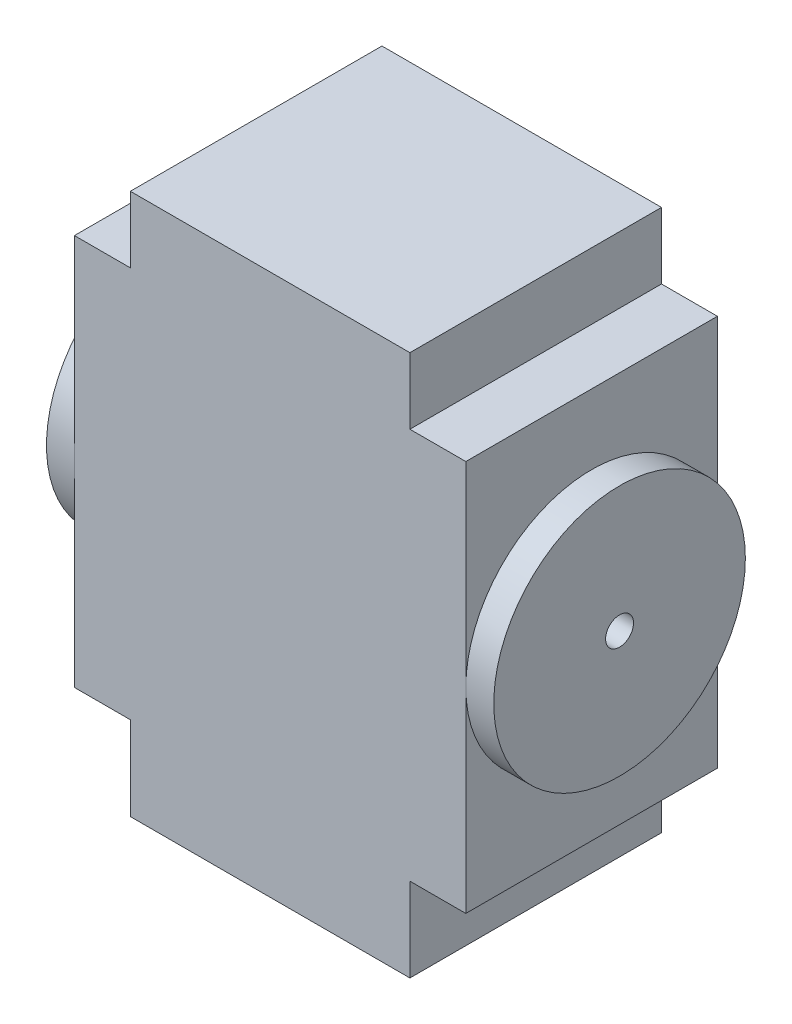
ISO-10303-21;
HEADER;
FILE_DESCRIPTION(('STEP AP214'),'2;1');
FILE_NAME('part.step','',(''),(''),'','','');
FILE_SCHEMA(('AUTOMOTIVE_DESIGN { 1 0 10303 214 1 1 1 1 }'));
ENDSEC;
DATA;
#1=APPLICATION_CONTEXT('core data for automotive mechanical design processes');
#2=APPLICATION_PROTOCOL_DEFINITION('international standard','automotive_design',2000,#1);
#3=PRODUCT_CONTEXT('',#1,'mechanical');
#4=PRODUCT('Part','Part','',(#3));
#5=PRODUCT_RELATED_PRODUCT_CATEGORY('part','',(#4));
#6=PRODUCT_DEFINITION_FORMATION('','',#4);
#7=PRODUCT_DEFINITION_CONTEXT('part definition',#1,'design');
#8=PRODUCT_DEFINITION('design','',#6,#7);
#9=PRODUCT_DEFINITION_SHAPE('','',#8);
#10=(LENGTH_UNIT() NAMED_UNIT(*) SI_UNIT(.MILLI.,.METRE.));
#11=(NAMED_UNIT(*) PLANE_ANGLE_UNIT() SI_UNIT($,.RADIAN.));
#12=(NAMED_UNIT(*) SI_UNIT($,.STERADIAN.) SOLID_ANGLE_UNIT());
#13=UNCERTAINTY_MEASURE_WITH_UNIT(LENGTH_MEASURE(1.E-05),#10,'distance_accuracy_value','');
#14=(GEOMETRIC_REPRESENTATION_CONTEXT(3) GLOBAL_UNCERTAINTY_ASSIGNED_CONTEXT((#13)) GLOBAL_UNIT_ASSIGNED_CONTEXT((#10,
#11,#12)) REPRESENTATION_CONTEXT('',''));
#15=CARTESIAN_POINT('',(0.,0.,0.));
#16=DIRECTION('',(0.,0.,1.));
#17=DIRECTION('',(1.,0.,0.));
#18=AXIS2_PLACEMENT_3D('',#15,#16,#17);
#19=CARTESIAN_POINT('',(-8.5906144898083,0.,-3.27253788630534));
#20=DIRECTION('',(-1.,0.,0.));
#21=DIRECTION('',(0.,0.,1.));
#22=AXIS2_PLACEMENT_3D('',#19,#20,#21);
#23=PLANE('',#22);
#24=DIRECTION('',(0.,-1.,0.));
#25=VECTOR('',#24,1.);
#26=CARTESIAN_POINT('',(-8.5906144898083,-8.59061448980831,-3.27253788630534));
#27=LINE('',#26,#25);
#28=CARTESIAN_POINT('',(-8.5906144898083,8.5906144898083,-3.27253788630534));
#29=VERTEX_POINT('',#28);
#30=CARTESIAN_POINT('',(-8.59061448980831,0.,-3.27253788630534));
#31=VERTEX_POINT('',#30);
#32=EDGE_CURVE('E259',#29,#31,#27,.T.);
#33=ORIENTED_EDGE('',*,*,#32,.T.);
#34=CARTESIAN_POINT('',(-8.59061448980831,0.,2.25));
#35=DIRECTION('',(1.,0.,0.));
#36=DIRECTION('',(0.,0.,-1.));
#37=AXIS2_PLACEMENT_3D('',#34,#35,#36);
#38=CIRCLE('',#37,5.52253788630534);
#39=CARTESIAN_POINT('',(-8.59061448980831,0.,7.77253788630534));
#40=VERTEX_POINT('',#39);
#41=EDGE_CURVE('E54',#31,#40,#38,.T.);
#42=ORIENTED_EDGE('',*,*,#41,.T.);
#43=DIRECTION('',(0.,1.,0.));
#44=VECTOR('',#43,1.);
#45=CARTESIAN_POINT('',(-8.5906144898083,-8.59061448980831,7.77253788630534));
#46=LINE('',#45,#44);
#47=CARTESIAN_POINT('',(-8.5906144898083,8.5906144898083,7.77253788630534));
#48=VERTEX_POINT('',#47);
#49=EDGE_CURVE('E335',#40,#48,#46,.T.);
#50=ORIENTED_EDGE('',*,*,#49,.T.);
#51=DIRECTION('',(0.,0.,-1.));
#52=VECTOR('',#51,1.);
#53=CARTESIAN_POINT('',(-8.5906144898083,8.5906144898083,7.77253788630534));
#54=LINE('',#53,#52);
#55=EDGE_CURVE('E264',#48,#29,#54,.T.);
#56=ORIENTED_EDGE('',*,*,#55,.T.);
#57=EDGE_LOOP('',(#33,#42,#50,#56));
#58=FACE_BOUND('',#57,.T.);
#59=ADVANCED_FACE('F42',(#58),#23,.T.);
#60=CARTESIAN_POINT('',(8.59061448980831,0.,-3.27253788630534));
#61=DIRECTION('',(-1.,0.,0.));
#62=DIRECTION('',(0.,0.,1.));
#63=AXIS2_PLACEMENT_3D('',#60,#61,#62);
#64=PLANE('',#63);
#65=CARTESIAN_POINT('',(8.59061448980831,0.,2.25));
#66=DIRECTION('',(1.,0.,0.));
#67=DIRECTION('',(0.,0.,-1.));
#68=AXIS2_PLACEMENT_3D('',#65,#66,#67);
#69=CIRCLE('',#68,5.52253788630534);
#70=CARTESIAN_POINT('',(8.59061448980831,0.,-3.27253788630534));
#71=VERTEX_POINT('',#70);
#72=CARTESIAN_POINT('',(8.59061448980831,0.,7.77253788630534));
#73=VERTEX_POINT('',#72);
#74=EDGE_CURVE('E208',#71,#73,#69,.T.);
#75=ORIENTED_EDGE('',*,*,#74,.F.);
#76=DIRECTION('',(0.,1.,0.));
#77=VECTOR('',#76,1.);
#78=CARTESIAN_POINT('',(8.59061448980831,-8.59061448980831,-3.27253788630534));
#79=LINE('',#78,#77);
#80=CARTESIAN_POINT('',(8.59061448980831,8.5906144898083,-3.27253788630534));
#81=VERTEX_POINT('',#80);
#82=EDGE_CURVE('E289',#71,#81,#79,.T.);
#83=ORIENTED_EDGE('',*,*,#82,.T.);
#84=DIRECTION('',(0.,0.,1.));
#85=VECTOR('',#84,1.);
#86=CARTESIAN_POINT('',(8.59061448980831,8.5906144898083,7.77253788630534));
#87=LINE('',#86,#85);
#88=CARTESIAN_POINT('',(8.59061448980831,8.5906144898083,7.77253788630534));
#89=VERTEX_POINT('',#88);
#90=EDGE_CURVE('E288',#81,#89,#87,.T.);
#91=ORIENTED_EDGE('',*,*,#90,.T.);
#92=DIRECTION('',(0.,-1.,0.));
#93=VECTOR('',#92,1.);
#94=CARTESIAN_POINT('',(8.59061448980831,-8.59061448980831,7.77253788630534));
#95=LINE('',#94,#93);
#96=EDGE_CURVE('E293',#89,#73,#95,.T.);
#97=ORIENTED_EDGE('',*,*,#96,.T.);
#98=EDGE_LOOP('',(#75,#83,#91,#97));
#99=FACE_BOUND('',#98,.T.);
#100=ADVANCED_FACE('F365',(#99),#64,.F.);
#101=CARTESIAN_POINT('',(-6.13615320700593,-12.2723064140119,7.77253788630534));
#102=DIRECTION('',(1.,0.,0.));
#103=DIRECTION('',(0.,0.,-1.));
#104=AXIS2_PLACEMENT_3D('',#101,#102,#103);
#105=PLANE('',#104);
#106=DIRECTION('',(0.,-1.,0.));
#107=VECTOR('',#106,1.);
#108=CARTESIAN_POINT('',(-6.13615320700593,-12.2723064140119,7.77253788630534));
#109=LINE('',#108,#107);
#110=CARTESIAN_POINT('',(-6.13615320700593,11.5023064140119,7.77253788630534));
#111=VERTEX_POINT('',#110);
#112=CARTESIAN_POINT('',(-6.13615320700593,8.5906144898083,7.77253788630534));
#113=VERTEX_POINT('',#112);
#114=EDGE_CURVE('E181',#111,#113,#109,.T.);
#115=ORIENTED_EDGE('',*,*,#114,.F.);
#116=DIRECTION('',(0.,0.,-1.));
#117=VECTOR('',#116,1.);
#118=CARTESIAN_POINT('',(-6.13615320700593,11.5023064140119,7.77253788630534));
#119=LINE('',#118,#117);
#120=CARTESIAN_POINT('',(-6.13615320700593,11.5023064140119,-3.27253788630534));
#121=VERTEX_POINT('',#120);
#122=EDGE_CURVE('E146',#111,#121,#119,.T.);
#123=ORIENTED_EDGE('',*,*,#122,.T.);
#124=DIRECTION('',(0.,-1.,0.));
#125=VECTOR('',#124,1.);
#126=CARTESIAN_POINT('',(-6.13615320700593,-12.2723064140119,-3.27253788630534));
#127=LINE('',#126,#125);
#128=CARTESIAN_POINT('',(-6.13615320700593,8.5906144898083,-3.27253788630534));
#129=VERTEX_POINT('',#128);
#130=EDGE_CURVE('E175',#121,#129,#127,.T.);
#131=ORIENTED_EDGE('',*,*,#130,.T.);
#132=DIRECTION('',(0.,0.,-1.));
#133=VECTOR('',#132,1.);
#134=CARTESIAN_POINT('',(-6.13615320700593,8.5906144898083,7.77253788630534));
#135=LINE('',#134,#133);
#136=EDGE_CURVE('E274',#113,#129,#135,.T.);
#137=ORIENTED_EDGE('',*,*,#136,.F.);
#138=EDGE_LOOP('',(#115,#123,#131,#137));
#139=FACE_BOUND('',#138,.T.);
#140=ADVANCED_FACE('F249',(#139),#105,.F.);
#141=DIRECTION('',(0.,0.,1.));
#142=VECTOR('',#141,1.);
#143=CARTESIAN_POINT('',(-6.13615320700593,-8.59061448980831,7.77253788630534));
#144=LINE('',#143,#142);
#145=CARTESIAN_POINT('',(-6.13615320700593,-8.59061448980831,-3.27253788630534));
#146=VERTEX_POINT('',#145);
#147=CARTESIAN_POINT('',(-6.13615320700593,-8.59061448980831,7.77253788630534));
#148=VERTEX_POINT('',#147);
#149=EDGE_CURVE('E220',#146,#148,#144,.T.);
#150=ORIENTED_EDGE('',*,*,#149,.F.);
#151=CARTESIAN_POINT('',(-6.13615320700593,-12.2723064140119,-3.27253788630534));
#152=VERTEX_POINT('',#151);
#153=EDGE_CURVE('E191',#146,#152,#127,.T.);
#154=ORIENTED_EDGE('',*,*,#153,.T.);
#155=DIRECTION('',(0.,0.,-1.));
#156=VECTOR('',#155,1.);
#157=CARTESIAN_POINT('',(-6.13615320700593,-12.2723064140119,7.77253788630534));
#158=LINE('',#157,#156);
#159=CARTESIAN_POINT('',(-6.13615320700593,-12.2723064140119,7.77253788630534));
#160=VERTEX_POINT('',#159);
#161=EDGE_CURVE('E46',#160,#152,#158,.T.);
#162=ORIENTED_EDGE('',*,*,#161,.F.);
#163=EDGE_CURVE('E174',#148,#160,#109,.T.);
#164=ORIENTED_EDGE('',*,*,#163,.F.);
#165=EDGE_LOOP('',(#150,#154,#162,#164));
#166=FACE_BOUND('',#165,.T.);
#167=ADVANCED_FACE('F323',(#166),#105,.F.);
#168=CARTESIAN_POINT('',(6.13615320700593,-12.2723064140119,7.77253788630534));
#169=DIRECTION('',(-1.,0.,0.));
#170=DIRECTION('',(0.,0.,1.));
#171=AXIS2_PLACEMENT_3D('',#168,#169,#170);
#172=PLANE('',#171);
#173=DIRECTION('',(0.,0.,-1.));
#174=VECTOR('',#173,1.);
#175=CARTESIAN_POINT('',(6.13615320700593,-8.59061448980831,7.77253788630534));
#176=LINE('',#175,#174);
#177=CARTESIAN_POINT('',(6.13615320700593,-8.59061448980831,7.77253788630534));
#178=VERTEX_POINT('',#177);
#179=CARTESIAN_POINT('',(6.13615320700593,-8.59061448980831,-3.27253788630534));
#180=VERTEX_POINT('',#179);
#181=EDGE_CURVE('E303',#178,#180,#176,.T.);
#182=ORIENTED_EDGE('',*,*,#181,.F.);
#183=DIRECTION('',(0.,1.,0.));
#184=VECTOR('',#183,1.);
#185=CARTESIAN_POINT('',(6.13615320700593,-12.2723064140119,7.77253788630534));
#186=LINE('',#185,#184);
#187=CARTESIAN_POINT('',(6.13615320700593,-12.2723064140119,7.77253788630534));
#188=VERTEX_POINT('',#187);
#189=EDGE_CURVE('E168',#188,#178,#186,.T.);
#190=ORIENTED_EDGE('',*,*,#189,.F.);
#191=DIRECTION('',(0.,0.,-1.));
#192=VECTOR('',#191,1.);
#193=CARTESIAN_POINT('',(6.13615320700593,-12.2723064140119,7.77253788630534));
#194=LINE('',#193,#192);
#195=CARTESIAN_POINT('',(6.13615320700593,-12.2723064140119,-3.27253788630534));
#196=VERTEX_POINT('',#195);
#197=EDGE_CURVE('E187',#188,#196,#194,.T.);
#198=ORIENTED_EDGE('',*,*,#197,.T.);
#199=DIRECTION('',(0.,1.,0.));
#200=VECTOR('',#199,1.);
#201=CARTESIAN_POINT('',(6.13615320700593,-12.2723064140119,-3.27253788630534));
#202=LINE('',#201,#200);
#203=EDGE_CURVE('E188',#196,#180,#202,.T.);
#204=ORIENTED_EDGE('',*,*,#203,.T.);
#205=EDGE_LOOP('',(#182,#190,#198,#204));
#206=FACE_BOUND('',#205,.T.);
#207=ADVANCED_FACE('F44',(#206),#172,.F.);
#208=CARTESIAN_POINT('',(6.13615320700593,8.5906144898083,-3.27253788630534));
#209=VERTEX_POINT('',#208);
#210=CARTESIAN_POINT('',(6.13615320700593,11.5023064140119,-3.27253788630534));
#211=VERTEX_POINT('',#210);
#212=EDGE_CURVE('E159',#209,#211,#202,.T.);
#213=ORIENTED_EDGE('',*,*,#212,.T.);
#214=DIRECTION('',(0.,0.,-1.));
#215=VECTOR('',#214,1.);
#216=CARTESIAN_POINT('',(6.13615320700593,11.5023064140119,7.77253788630534));
#217=LINE('',#216,#215);
#218=CARTESIAN_POINT('',(6.13615320700593,11.5023064140119,7.77253788630534));
#219=VERTEX_POINT('',#218);
#220=EDGE_CURVE('E61',#219,#211,#217,.T.);
#221=ORIENTED_EDGE('',*,*,#220,.F.);
#222=CARTESIAN_POINT('',(6.13615320700593,8.5906144898083,7.77253788630534));
#223=VERTEX_POINT('',#222);
#224=EDGE_CURVE('E156',#223,#219,#186,.T.);
#225=ORIENTED_EDGE('',*,*,#224,.F.);
#226=DIRECTION('',(0.,0.,1.));
#227=VECTOR('',#226,1.);
#228=CARTESIAN_POINT('',(6.13615320700593,8.5906144898083,7.77253788630534));
#229=LINE('',#228,#227);
#230=EDGE_CURVE('E284',#209,#223,#229,.T.);
#231=ORIENTED_EDGE('',*,*,#230,.F.);
#232=EDGE_LOOP('',(#213,#221,#225,#231));
#233=FACE_BOUND('',#232,.T.);
#234=ADVANCED_FACE('F155',(#233),#172,.F.);
#235=CARTESIAN_POINT('',(-6.13615320700593,-12.2723064140119,7.77253788630534));
#236=DIRECTION('',(0.,1.,0.));
#237=DIRECTION('',(0.,0.,1.));
#238=AXIS2_PLACEMENT_3D('',#235,#236,#237);
#239=PLANE('',#238);
#240=DIRECTION('',(1.,0.,0.));
#241=VECTOR('',#240,1.);
#242=CARTESIAN_POINT('',(-6.13615320700593,-12.2723064140119,-3.27253788630534));
#243=LINE('',#242,#241);
#244=EDGE_CURVE('E169',#152,#196,#243,.T.);
#245=ORIENTED_EDGE('',*,*,#244,.T.);
#246=ORIENTED_EDGE('',*,*,#197,.F.);
#247=DIRECTION('',(1.,0.,0.));
#248=VECTOR('',#247,1.);
#249=CARTESIAN_POINT('',(-6.13615320700593,-12.2723064140119,7.77253788630534));
#250=LINE('',#249,#248);
#251=EDGE_CURVE('E184',#160,#188,#250,.T.);
#252=ORIENTED_EDGE('',*,*,#251,.F.);
#253=ORIENTED_EDGE('',*,*,#161,.T.);
#254=EDGE_LOOP('',(#245,#246,#252,#253));
#255=FACE_BOUND('',#254,.T.);
#256=ADVANCED_FACE('F352',(#255),#239,.F.);
#257=CARTESIAN_POINT('',(0.,0.,7.77253788630534));
#258=DIRECTION('',(0.,0.,-1.));
#259=DIRECTION('',(-1.,0.,0.));
#260=AXIS2_PLACEMENT_3D('',#257,#258,#259);
#261=PLANE('',#260);
#262=ORIENTED_EDGE('',*,*,#224,.T.);
#263=DIRECTION('',(-1.,0.,0.));
#264=VECTOR('',#263,1.);
#265=CARTESIAN_POINT('',(6.13615320700593,11.5023064140119,7.77253788630534));
#266=LINE('',#265,#264);
#267=EDGE_CURVE('E143',#219,#111,#266,.T.);
#268=ORIENTED_EDGE('',*,*,#267,.T.);
#269=ORIENTED_EDGE('',*,*,#114,.T.);
#270=DIRECTION('',(1.,0.,0.));
#271=VECTOR('',#270,1.);
#272=CARTESIAN_POINT('',(-8.5906144898083,8.5906144898083,7.77253788630534));
#273=LINE('',#272,#271);
#274=EDGE_CURVE('E263',#48,#113,#273,.T.);
#275=ORIENTED_EDGE('',*,*,#274,.F.);
#276=ORIENTED_EDGE('',*,*,#49,.F.);
#277=CARTESIAN_POINT('',(-8.5906144898083,-8.59061448980831,7.77253788630534));
#278=VERTEX_POINT('',#277);
#279=EDGE_CURVE('E271',#278,#40,#46,.T.);
#280=ORIENTED_EDGE('',*,*,#279,.F.);
#281=DIRECTION('',(1.,0.,0.));
#282=VECTOR('',#281,1.);
#283=CARTESIAN_POINT('',(-8.5906144898083,-8.59061448980831,7.77253788630534));
#284=LINE('',#283,#282);
#285=EDGE_CURVE('E269',#278,#148,#284,.T.);
#286=ORIENTED_EDGE('',*,*,#285,.T.);
#287=ORIENTED_EDGE('',*,*,#163,.T.);
#288=ORIENTED_EDGE('',*,*,#251,.T.);
#289=ORIENTED_EDGE('',*,*,#189,.T.);
#290=DIRECTION('',(-1.,0.,0.));
#291=VECTOR('',#290,1.);
#292=CARTESIAN_POINT('',(8.59061448980831,-8.59061448980831,7.77253788630534));
#293=LINE('',#292,#291);
#294=CARTESIAN_POINT('',(8.59061448980831,-8.59061448980831,7.77253788630534));
#295=VERTEX_POINT('',#294);
#296=EDGE_CURVE('E310',#295,#178,#293,.T.);
#297=ORIENTED_EDGE('',*,*,#296,.F.);
#298=EDGE_CURVE('E292',#73,#295,#95,.T.);
#299=ORIENTED_EDGE('',*,*,#298,.F.);
#300=ORIENTED_EDGE('',*,*,#96,.F.);
#301=DIRECTION('',(-1.,0.,0.));
#302=VECTOR('',#301,1.);
#303=CARTESIAN_POINT('',(8.59061448980831,8.5906144898083,7.77253788630534));
#304=LINE('',#303,#302);
#305=EDGE_CURVE('E166',#89,#223,#304,.T.);
#306=ORIENTED_EDGE('',*,*,#305,.T.);
#307=EDGE_LOOP('',(#262,#268,#269,#275,#276,#280,#286,#287,#288,#289,#297,#299,#300,#306));
#308=FACE_BOUND('',#307,.T.);
#309=ADVANCED_FACE('F163',(#308),#261,.F.);
#310=CARTESIAN_POINT('',(0.,0.,-3.27253788630534));
#311=DIRECTION('',(0.,0.,-1.));
#312=DIRECTION('',(-1.,0.,0.));
#313=AXIS2_PLACEMENT_3D('',#310,#311,#312);
#314=PLANE('',#313);
#315=DIRECTION('',(-1.,0.,0.));
#316=VECTOR('',#315,1.);
#317=CARTESIAN_POINT('',(6.13615320700593,11.5023064140119,-3.27253788630534));
#318=LINE('',#317,#316);
#319=EDGE_CURVE('E151',#211,#121,#318,.T.);
#320=ORIENTED_EDGE('',*,*,#319,.F.);
#321=ORIENTED_EDGE('',*,*,#212,.F.);
#322=DIRECTION('',(-1.,0.,0.));
#323=VECTOR('',#322,1.);
#324=CARTESIAN_POINT('',(8.59061448980831,8.5906144898083,-3.27253788630534));
#325=LINE('',#324,#323);
#326=EDGE_CURVE('E179',#81,#209,#325,.T.);
#327=ORIENTED_EDGE('',*,*,#326,.F.);
#328=ORIENTED_EDGE('',*,*,#82,.F.);
#329=CARTESIAN_POINT('',(8.59061448980831,-8.59061448980831,-3.27253788630534));
#330=VERTEX_POINT('',#329);
#331=EDGE_CURVE('E285',#330,#71,#79,.T.);
#332=ORIENTED_EDGE('',*,*,#331,.F.);
#333=DIRECTION('',(-1.,0.,0.));
#334=VECTOR('',#333,1.);
#335=CARTESIAN_POINT('',(8.59061448980831,-8.59061448980831,-3.27253788630534));
#336=LINE('',#335,#334);
#337=EDGE_CURVE('E300',#330,#180,#336,.T.);
#338=ORIENTED_EDGE('',*,*,#337,.T.);
#339=ORIENTED_EDGE('',*,*,#203,.F.);
#340=ORIENTED_EDGE('',*,*,#244,.F.);
#341=ORIENTED_EDGE('',*,*,#153,.F.);
#342=DIRECTION('',(1.,0.,0.));
#343=VECTOR('',#342,1.);
#344=CARTESIAN_POINT('',(-8.5906144898083,-8.59061448980831,-3.27253788630534));
#345=LINE('',#344,#343);
#346=CARTESIAN_POINT('',(-8.5906144898083,-8.59061448980831,-3.27253788630534));
#347=VERTEX_POINT('',#346);
#348=EDGE_CURVE('E280',#347,#146,#345,.T.);
#349=ORIENTED_EDGE('',*,*,#348,.F.);
#350=EDGE_CURVE('E340',#31,#347,#27,.T.);
#351=ORIENTED_EDGE('',*,*,#350,.F.);
#352=ORIENTED_EDGE('',*,*,#32,.F.);
#353=DIRECTION('',(1.,0.,0.));
#354=VECTOR('',#353,1.);
#355=CARTESIAN_POINT('',(-8.5906144898083,8.5906144898083,-3.27253788630534));
#356=LINE('',#355,#354);
#357=EDGE_CURVE('E256',#29,#129,#356,.T.);
#358=ORIENTED_EDGE('',*,*,#357,.T.);
#359=ORIENTED_EDGE('',*,*,#130,.F.);
#360=EDGE_LOOP('',(#320,#321,#327,#328,#332,#338,#339,#340,#341,#349,#351,#352,#358,#359));
#361=FACE_BOUND('',#360,.T.);
#362=ADVANCED_FACE('F253',(#361),#314,.T.);
#363=CARTESIAN_POINT('',(8.59061448980831,8.5906144898083,7.77253788630534));
#364=DIRECTION('',(0.,-1.,0.));
#365=DIRECTION('',(0.,0.,-1.));
#366=AXIS2_PLACEMENT_3D('',#363,#364,#365);
#367=PLANE('',#366);
#368=ORIENTED_EDGE('',*,*,#230,.T.);
#369=ORIENTED_EDGE('',*,*,#305,.F.);
#370=ORIENTED_EDGE('',*,*,#90,.F.);
#371=ORIENTED_EDGE('',*,*,#326,.T.);
#372=EDGE_LOOP('',(#368,#369,#370,#371));
#373=FACE_BOUND('',#372,.T.);
#374=ADVANCED_FACE('F366',(#373),#367,.F.);
#375=CARTESIAN_POINT('',(8.59061448980831,-8.59061448980831,7.77253788630534));
#376=DIRECTION('',(0.,1.,0.));
#377=DIRECTION('',(0.,0.,1.));
#378=AXIS2_PLACEMENT_3D('',#375,#376,#377);
#379=PLANE('',#378);
#380=ORIENTED_EDGE('',*,*,#181,.T.);
#381=ORIENTED_EDGE('',*,*,#337,.F.);
#382=DIRECTION('',(0.,0.,-1.));
#383=VECTOR('',#382,1.);
#384=CARTESIAN_POINT('',(8.59061448980831,-8.59061448980831,7.77253788630534));
#385=LINE('',#384,#383);
#386=EDGE_CURVE('E297',#295,#330,#385,.T.);
#387=ORIENTED_EDGE('',*,*,#386,.F.);
#388=ORIENTED_EDGE('',*,*,#296,.T.);
#389=EDGE_LOOP('',(#380,#381,#387,#388));
#390=FACE_BOUND('',#389,.T.);
#391=ADVANCED_FACE('F355',(#390),#379,.F.);
#392=EDGE_CURVE('E52',#73,#71,#69,.T.);
#393=ORIENTED_EDGE('',*,*,#392,.F.);
#394=ORIENTED_EDGE('',*,*,#298,.T.);
#395=ORIENTED_EDGE('',*,*,#386,.T.);
#396=ORIENTED_EDGE('',*,*,#331,.T.);
#397=EDGE_LOOP('',(#393,#394,#395,#396));
#398=FACE_BOUND('',#397,.T.);
#399=ADVANCED_FACE('F360',(#398),#64,.F.);
#400=CARTESIAN_POINT('',(-8.5906144898083,-8.59061448980831,7.77253788630534));
#401=DIRECTION('',(0.,1.,0.));
#402=DIRECTION('',(0.,0.,1.));
#403=AXIS2_PLACEMENT_3D('',#400,#401,#402);
#404=PLANE('',#403);
#405=ORIENTED_EDGE('',*,*,#149,.T.);
#406=ORIENTED_EDGE('',*,*,#285,.F.);
#407=DIRECTION('',(0.,0.,1.));
#408=VECTOR('',#407,1.);
#409=CARTESIAN_POINT('',(-8.5906144898083,-8.59061448980831,7.77253788630534));
#410=LINE('',#409,#408);
#411=EDGE_CURVE('E330',#347,#278,#410,.T.);
#412=ORIENTED_EDGE('',*,*,#411,.F.);
#413=ORIENTED_EDGE('',*,*,#348,.T.);
#414=EDGE_LOOP('',(#405,#406,#412,#413));
#415=FACE_BOUND('',#414,.T.);
#416=ADVANCED_FACE('F328',(#415),#404,.F.);
#417=CARTESIAN_POINT('',(-8.5906144898083,8.5906144898083,7.77253788630534));
#418=DIRECTION('',(0.,-1.,0.));
#419=DIRECTION('',(0.,0.,-1.));
#420=AXIS2_PLACEMENT_3D('',#417,#418,#419);
#421=PLANE('',#420);
#422=ORIENTED_EDGE('',*,*,#136,.T.);
#423=ORIENTED_EDGE('',*,*,#357,.F.);
#424=ORIENTED_EDGE('',*,*,#55,.F.);
#425=ORIENTED_EDGE('',*,*,#274,.T.);
#426=EDGE_LOOP('',(#422,#423,#424,#425));
#427=FACE_BOUND('',#426,.T.);
#428=ADVANCED_FACE('F349',(#427),#421,.F.);
#429=ORIENTED_EDGE('',*,*,#279,.T.);
#430=EDGE_CURVE('E11',#40,#31,#38,.T.);
#431=ORIENTED_EDGE('',*,*,#430,.T.);
#432=ORIENTED_EDGE('',*,*,#350,.T.);
#433=ORIENTED_EDGE('',*,*,#411,.T.);
#434=EDGE_LOOP('',(#429,#431,#432,#433));
#435=FACE_BOUND('',#434,.T.);
#436=ADVANCED_FACE('F345',(#435),#23,.T.);
#437=CARTESIAN_POINT('',(9.81784513120949,0.,2.25));
#438=DIRECTION('',(-1.,0.,0.));
#439=DIRECTION('',(0.,0.,1.));
#440=AXIS2_PLACEMENT_3D('',#437,#438,#439);
#441=CYLINDRICAL_SURFACE('',#440,5.52253788630534);
#442=CARTESIAN_POINT('',(9.81784513120949,0.,2.25));
#443=DIRECTION('',(1.,0.,0.));
#444=DIRECTION('',(0.,0.,-1.));
#445=AXIS2_PLACEMENT_3D('',#442,#443,#444);
#446=CIRCLE('',#445,5.52253788630534);
#447=CARTESIAN_POINT('',(9.81784513120949,0.,-3.27253788630534));
#448=VERTEX_POINT('',#447);
#449=EDGE_CURVE('E214',#448,#448,#446,.T.);
#450=ORIENTED_EDGE('',*,*,#449,.F.);
#451=EDGE_LOOP('',(#450));
#452=FACE_BOUND('',#451,.T.);
#453=ORIENTED_EDGE('',*,*,#74,.T.);
#454=ORIENTED_EDGE('',*,*,#392,.T.);
#455=EDGE_LOOP('',(#453,#454));
#456=FACE_BOUND('',#455,.T.);
#457=ADVANCED_FACE('F386',(#452,#456),#441,.T.);
#458=CARTESIAN_POINT('',(9.81784513120949,0.,2.25));
#459=DIRECTION('',(1.,0.,0.));
#460=DIRECTION('',(0.,0.,-1.));
#461=AXIS2_PLACEMENT_3D('',#458,#459,#460);
#462=PLANE('',#461);
#463=CARTESIAN_POINT('',(9.81784513120949,0.,2.25));
#464=DIRECTION('',(1.,0.,0.));
#465=DIRECTION('',(0.,0.,-1.));
#466=AXIS2_PLACEMENT_3D('',#463,#464,#465);
#467=CIRCLE('',#466,0.613615320700593);
#468=CARTESIAN_POINT('',(9.81784513120949,0.,1.63638467929941));
#469=VERTEX_POINT('',#468);
#470=EDGE_CURVE('E228',#469,#469,#467,.T.);
#471=ORIENTED_EDGE('',*,*,#470,.F.);
#472=EDGE_LOOP('',(#471));
#473=FACE_BOUND('',#472,.T.);
#474=ORIENTED_EDGE('',*,*,#449,.T.);
#475=EDGE_LOOP('',(#474));
#476=FACE_BOUND('',#475,.T.);
#477=ADVANCED_FACE('F391',(#473,#476),#462,.T.);
#478=CARTESIAN_POINT('',(-9.81784513120949,0.,2.25));
#479=DIRECTION('',(1.,0.,0.));
#480=DIRECTION('',(0.,0.,-1.));
#481=AXIS2_PLACEMENT_3D('',#478,#479,#480);
#482=CYLINDRICAL_SURFACE('',#481,5.52253788630534);
#483=CARTESIAN_POINT('',(-9.81784513120949,0.,2.25));
#484=DIRECTION('',(1.,0.,0.));
#485=DIRECTION('',(0.,0.,-1.));
#486=AXIS2_PLACEMENT_3D('',#483,#484,#485);
#487=CIRCLE('',#486,5.52253788630534);
#488=CARTESIAN_POINT('',(-9.81784513120949,0.,-3.27253788630534));
#489=VERTEX_POINT('',#488);
#490=EDGE_CURVE('E215',#489,#489,#487,.T.);
#491=ORIENTED_EDGE('',*,*,#490,.T.);
#492=EDGE_LOOP('',(#491));
#493=FACE_BOUND('',#492,.T.);
#494=ORIENTED_EDGE('',*,*,#41,.F.);
#495=ORIENTED_EDGE('',*,*,#430,.F.);
#496=EDGE_LOOP('',(#494,#495));
#497=FACE_BOUND('',#496,.T.);
#498=ADVANCED_FACE('F445',(#493,#497),#482,.T.);
#499=CARTESIAN_POINT('',(-9.81784513120949,0.,2.25));
#500=DIRECTION('',(-1.,0.,0.));
#501=DIRECTION('',(0.,0.,-1.));
#502=AXIS2_PLACEMENT_3D('',#499,#500,#501);
#503=PLANE('',#502);
#504=CARTESIAN_POINT('',(-9.81784513120949,0.,2.25));
#505=DIRECTION('',(-1.,0.,0.));
#506=DIRECTION('',(0.,0.,1.));
#507=AXIS2_PLACEMENT_3D('',#504,#505,#506);
#508=CIRCLE('',#507,0.613615320700593);
#509=CARTESIAN_POINT('',(-9.81784513120949,0.,2.86361532070059));
#510=VERTEX_POINT('',#509);
#511=EDGE_CURVE('E236',#510,#510,#508,.T.);
#512=ORIENTED_EDGE('',*,*,#511,.F.);
#513=EDGE_LOOP('',(#512));
#514=FACE_BOUND('',#513,.T.);
#515=ORIENTED_EDGE('',*,*,#490,.F.);
#516=EDGE_LOOP('',(#515));
#517=FACE_BOUND('',#516,.T.);
#518=ADVANCED_FACE('F449',(#514,#517),#503,.T.);
#519=CARTESIAN_POINT('',(8.59061448980831,0.,2.25));
#520=DIRECTION('',(1.,0.,0.));
#521=DIRECTION('',(0.,0.,-1.));
#522=AXIS2_PLACEMENT_3D('',#519,#520,#521);
#523=CYLINDRICAL_SURFACE('',#522,0.613615320700593);
#524=CARTESIAN_POINT('',(8.59061448980831,0.,2.25));
#525=DIRECTION('',(1.,0.,0.));
#526=DIRECTION('',(0.,0.,-1.));
#527=AXIS2_PLACEMENT_3D('',#524,#525,#526);
#528=CIRCLE('',#527,0.613615320700593);
#529=CARTESIAN_POINT('',(8.59061448980831,0.,1.63638467929941));
#530=VERTEX_POINT('',#529);
#531=EDGE_CURVE('E226',#530,#530,#528,.T.);
#532=ORIENTED_EDGE('',*,*,#531,.F.);
#533=EDGE_LOOP('',(#532));
#534=FACE_BOUND('',#533,.T.);
#535=ORIENTED_EDGE('',*,*,#470,.T.);
#536=EDGE_LOOP('',(#535));
#537=FACE_BOUND('',#536,.T.);
#538=ADVANCED_FACE('F457',(#534,#537),#523,.F.);
#539=CARTESIAN_POINT('',(8.59061448980831,0.,2.25));
#540=DIRECTION('',(1.,0.,0.));
#541=DIRECTION('',(0.,0.,-1.));
#542=AXIS2_PLACEMENT_3D('',#539,#540,#541);
#543=PLANE('',#542);
#544=ORIENTED_EDGE('',*,*,#531,.T.);
#545=EDGE_LOOP('',(#544));
#546=FACE_BOUND('',#545,.T.);
#547=ADVANCED_FACE('F461',(#546),#543,.T.);
#548=CARTESIAN_POINT('',(-8.59061448980831,0.,2.25));
#549=DIRECTION('',(-1.,0.,0.));
#550=DIRECTION('',(0.,0.,1.));
#551=AXIS2_PLACEMENT_3D('',#548,#549,#550);
#552=CYLINDRICAL_SURFACE('',#551,0.613615320700593);
#553=CARTESIAN_POINT('',(-8.59061448980831,0.,2.25));
#554=DIRECTION('',(-1.,0.,0.));
#555=DIRECTION('',(0.,0.,1.));
#556=AXIS2_PLACEMENT_3D('',#553,#554,#555);
#557=CIRCLE('',#556,0.613615320700593);
#558=CARTESIAN_POINT('',(-8.59061448980831,0.,2.86361532070059));
#559=VERTEX_POINT('',#558);
#560=EDGE_CURVE('E232',#559,#559,#557,.T.);
#561=ORIENTED_EDGE('',*,*,#560,.F.);
#562=EDGE_LOOP('',(#561));
#563=FACE_BOUND('',#562,.T.);
#564=ORIENTED_EDGE('',*,*,#511,.T.);
#565=EDGE_LOOP('',(#564));
#566=FACE_BOUND('',#565,.T.);
#567=ADVANCED_FACE('F479',(#563,#566),#552,.F.);
#568=CARTESIAN_POINT('',(-8.59061448980831,0.,2.25));
#569=DIRECTION('',(-1.,0.,0.));
#570=DIRECTION('',(0.,0.,1.));
#571=AXIS2_PLACEMENT_3D('',#568,#569,#570);
#572=PLANE('',#571);
#573=ORIENTED_EDGE('',*,*,#560,.T.);
#574=EDGE_LOOP('',(#573));
#575=FACE_BOUND('',#574,.T.);
#576=ADVANCED_FACE('F482',(#575),#572,.T.);
#577=CARTESIAN_POINT('',(6.13615320700593,11.5023064140119,7.77253788630534));
#578=DIRECTION('',(0.,-1.,0.));
#579=DIRECTION('',(0.,0.,-1.));
#580=AXIS2_PLACEMENT_3D('',#577,#578,#579);
#581=PLANE('',#580);
#582=ORIENTED_EDGE('',*,*,#267,.F.);
#583=ORIENTED_EDGE('',*,*,#220,.T.);
#584=ORIENTED_EDGE('',*,*,#319,.T.);
#585=ORIENTED_EDGE('',*,*,#122,.F.);
#586=EDGE_LOOP('',(#582,#583,#584,#585));
#587=FACE_BOUND('',#586,.T.);
#588=ADVANCED_FACE('F144',(#587),#581,.F.);
#589=CLOSED_SHELL('',(#59,#100,#140,#167,#207,#234,#256,#309,#362,#374,#391,#399,#416,#428,#436,
#457,#477,#498,#518,#538,#547,#567,#576,#588));
#590=MANIFOLD_SOLID_BREP('B2',#589);
#591=ADVANCED_BREP_SHAPE_REPRESENTATION('',(#18,#590),#14);
#592=SHAPE_DEFINITION_REPRESENTATION(#9,#591);
ENDSEC;
END-ISO-10303-21;
